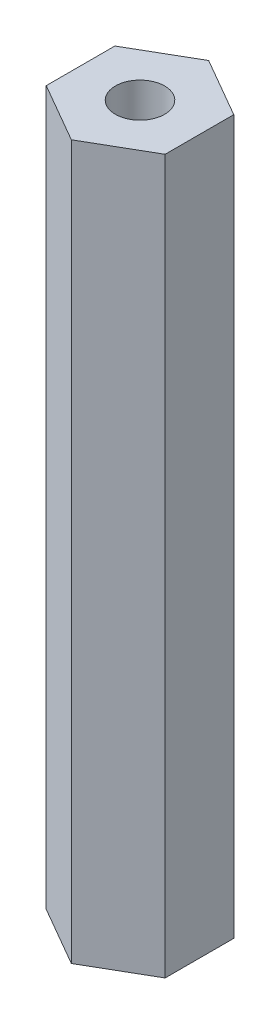
ISO-10303-21;
HEADER;
FILE_DESCRIPTION(('STEP AP214'),'2;1');
FILE_NAME('part.step','',(''),(''),'','','');
FILE_SCHEMA(('AUTOMOTIVE_DESIGN { 1 0 10303 214 1 1 1 1 }'));
ENDSEC;
DATA;
#1=APPLICATION_CONTEXT('core data for automotive mechanical design processes');
#2=APPLICATION_PROTOCOL_DEFINITION('international standard','automotive_design',2000,#1);
#3=PRODUCT_CONTEXT('',#1,'mechanical');
#4=PRODUCT('Part','Part','',(#3));
#5=PRODUCT_RELATED_PRODUCT_CATEGORY('part','',(#4));
#6=PRODUCT_DEFINITION_FORMATION('','',#4);
#7=PRODUCT_DEFINITION_CONTEXT('part definition',#1,'design');
#8=PRODUCT_DEFINITION('design','',#6,#7);
#9=PRODUCT_DEFINITION_SHAPE('','',#8);
#10=(LENGTH_UNIT() NAMED_UNIT(*) SI_UNIT(.MILLI.,.METRE.));
#11=(NAMED_UNIT(*) PLANE_ANGLE_UNIT() SI_UNIT($,.RADIAN.));
#12=(NAMED_UNIT(*) SI_UNIT($,.STERADIAN.) SOLID_ANGLE_UNIT());
#13=UNCERTAINTY_MEASURE_WITH_UNIT(LENGTH_MEASURE(1.E-05),#10,'distance_accuracy_value','');
#14=(GEOMETRIC_REPRESENTATION_CONTEXT(3) GLOBAL_UNCERTAINTY_ASSIGNED_CONTEXT((#13)) GLOBAL_UNIT_ASSIGNED_CONTEXT((#10,
#11,#12)) REPRESENTATION_CONTEXT('',''));
#15=CARTESIAN_POINT('',(0.,0.,0.));
#16=DIRECTION('',(0.,0.,1.));
#17=DIRECTION('',(1.,0.,0.));
#18=AXIS2_PLACEMENT_3D('',#15,#16,#17);
#19=CARTESIAN_POINT('',(0.,76.2,0.));
#20=DIRECTION('',(0.,1.,0.));
#21=DIRECTION('',(0.,0.,1.));
#22=AXIS2_PLACEMENT_3D('',#19,#20,#21);
#23=PLANE('',#22);
#24=DIRECTION('',(-0.866025403784442,0.,-0.499999999999995));
#25=VECTOR('',#24,1.);
#26=CARTESIAN_POINT('',(6.34999999999995,76.2,-3.66617420935419));
#27=LINE('',#26,#25);
#28=CARTESIAN_POINT('',(6.34999999999995,76.2,-3.66617420935419));
#29=VERTEX_POINT('',#28);
#30=CARTESIAN_POINT('',(0.,76.2,-7.33234841870824));
#31=VERTEX_POINT('',#30);
#32=EDGE_CURVE('E130',#29,#31,#27,.T.);
#33=ORIENTED_EDGE('',*,*,#32,.T.);
#34=DIRECTION('',(-0.866025403784438,0.,0.500000000000001));
#35=VECTOR('',#34,1.);
#36=CARTESIAN_POINT('',(0.,76.2,-7.33234841870824));
#37=LINE('',#36,#35);
#38=CARTESIAN_POINT('',(-6.35,76.2,-3.6661742093541));
#39=VERTEX_POINT('',#38);
#40=EDGE_CURVE('E88',#31,#39,#37,.T.);
#41=ORIENTED_EDGE('',*,*,#40,.T.);
#42=DIRECTION('',(0.,0.,1.));
#43=VECTOR('',#42,1.);
#44=CARTESIAN_POINT('',(-6.35,76.2,-3.6661742093541));
#45=LINE('',#44,#43);
#46=CARTESIAN_POINT('',(-6.34999999999997,76.2,3.66617420935415));
#47=VERTEX_POINT('',#46);
#48=EDGE_CURVE('E101',#39,#47,#45,.T.);
#49=ORIENTED_EDGE('',*,*,#48,.T.);
#50=DIRECTION('',(0.866025403784442,0.,0.499999999999995));
#51=VECTOR('',#50,1.);
#52=CARTESIAN_POINT('',(-6.34999999999997,76.2,3.66617420935415));
#53=LINE('',#52,#51);
#54=CARTESIAN_POINT('',(0.,76.2,7.33234841870823));
#55=VERTEX_POINT('',#54);
#56=EDGE_CURVE('E95',#47,#55,#53,.T.);
#57=ORIENTED_EDGE('',*,*,#56,.T.);
#58=DIRECTION('',(0.866025403784435,0.,-0.500000000000007));
#59=VECTOR('',#58,1.);
#60=CARTESIAN_POINT('',(0.,76.2,7.33234841870823));
#61=LINE('',#60,#59);
#62=CARTESIAN_POINT('',(6.35000000000002,76.2,3.66617420935406));
#63=VERTEX_POINT('',#62);
#64=EDGE_CURVE('E99',#55,#63,#61,.T.);
#65=ORIENTED_EDGE('',*,*,#64,.T.);
#66=DIRECTION('',(0.,0.,-1.));
#67=VECTOR('',#66,1.);
#68=CARTESIAN_POINT('',(6.35000000000002,76.2,3.66617420935406));
#69=LINE('',#68,#67);
#70=EDGE_CURVE('E51',#63,#29,#69,.T.);
#71=ORIENTED_EDGE('',*,*,#70,.T.);
#72=EDGE_LOOP('',(#33,#41,#49,#57,#65,#71));
#73=FACE_BOUND('',#72,.T.);
#74=CARTESIAN_POINT('',(0.,76.2,0.));
#75=DIRECTION('',(0.,1.,0.));
#76=DIRECTION('',(0.,0.,1.));
#77=AXIS2_PLACEMENT_3D('',#74,#75,#76);
#78=CIRCLE('',#77,2.6289);
#79=CARTESIAN_POINT('',(0.,76.2,-2.6289));
#80=VERTEX_POINT('',#79);
#81=EDGE_CURVE('E123',#80,#80,#78,.T.);
#82=ORIENTED_EDGE('',*,*,#81,.F.);
#83=EDGE_LOOP('',(#82));
#84=FACE_BOUND('',#83,.T.);
#85=ADVANCED_FACE('F34',(#73,#84),#23,.T.);
#86=CARTESIAN_POINT('',(0.,0.,0.));
#87=DIRECTION('',(0.,1.,0.));
#88=DIRECTION('',(0.,0.,1.));
#89=AXIS2_PLACEMENT_3D('',#86,#87,#88);
#90=PLANE('',#89);
#91=DIRECTION('',(-0.866025403784442,0.,-0.499999999999995));
#92=VECTOR('',#91,1.);
#93=CARTESIAN_POINT('',(6.34999999999995,0.,-3.66617420935419));
#94=LINE('',#93,#92);
#95=CARTESIAN_POINT('',(6.34999999999995,0.,-3.66617420935419));
#96=VERTEX_POINT('',#95);
#97=CARTESIAN_POINT('',(0.,0.,-7.33234841870824));
#98=VERTEX_POINT('',#97);
#99=EDGE_CURVE('E119',#96,#98,#94,.T.);
#100=ORIENTED_EDGE('',*,*,#99,.F.);
#101=DIRECTION('',(0.,0.,-1.));
#102=VECTOR('',#101,1.);
#103=CARTESIAN_POINT('',(6.35000000000002,0.,3.66617420935406));
#104=LINE('',#103,#102);
#105=CARTESIAN_POINT('',(6.35000000000002,0.,3.66617420935406));
#106=VERTEX_POINT('',#105);
#107=EDGE_CURVE('E80',#106,#96,#104,.T.);
#108=ORIENTED_EDGE('',*,*,#107,.F.);
#109=DIRECTION('',(0.866025403784435,0.,-0.500000000000007));
#110=VECTOR('',#109,1.);
#111=CARTESIAN_POINT('',(0.,0.,7.33234841870823));
#112=LINE('',#111,#110);
#113=CARTESIAN_POINT('',(0.,0.,7.33234841870823));
#114=VERTEX_POINT('',#113);
#115=EDGE_CURVE('E74',#114,#106,#112,.T.);
#116=ORIENTED_EDGE('',*,*,#115,.F.);
#117=DIRECTION('',(0.866025403784442,0.,0.499999999999995));
#118=VECTOR('',#117,1.);
#119=CARTESIAN_POINT('',(-6.34999999999997,0.,3.66617420935415));
#120=LINE('',#119,#118);
#121=CARTESIAN_POINT('',(-6.34999999999997,0.,3.66617420935415));
#122=VERTEX_POINT('',#121);
#123=EDGE_CURVE('E109',#122,#114,#120,.T.);
#124=ORIENTED_EDGE('',*,*,#123,.F.);
#125=DIRECTION('',(0.,0.,1.));
#126=VECTOR('',#125,1.);
#127=CARTESIAN_POINT('',(-6.35,0.,-3.6661742093541));
#128=LINE('',#127,#126);
#129=CARTESIAN_POINT('',(-6.35,0.,-3.6661742093541));
#130=VERTEX_POINT('',#129);
#131=EDGE_CURVE('E125',#130,#122,#128,.T.);
#132=ORIENTED_EDGE('',*,*,#131,.F.);
#133=DIRECTION('',(-0.866025403784438,0.,0.500000000000001));
#134=VECTOR('',#133,1.);
#135=CARTESIAN_POINT('',(0.,0.,-7.33234841870824));
#136=LINE('',#135,#134);
#137=EDGE_CURVE('E122',#98,#130,#136,.T.);
#138=ORIENTED_EDGE('',*,*,#137,.F.);
#139=EDGE_LOOP('',(#100,#108,#116,#124,#132,#138));
#140=FACE_BOUND('',#139,.T.);
#141=CARTESIAN_POINT('',(0.,0.,0.));
#142=DIRECTION('',(0.,1.,0.));
#143=DIRECTION('',(0.,0.,1.));
#144=AXIS2_PLACEMENT_3D('',#141,#142,#143);
#145=CIRCLE('',#144,2.6289);
#146=CARTESIAN_POINT('',(0.,0.,-2.6289));
#147=VERTEX_POINT('',#146);
#148=EDGE_CURVE('E223',#147,#147,#145,.T.);
#149=ORIENTED_EDGE('',*,*,#148,.T.);
#150=EDGE_LOOP('',(#149));
#151=FACE_BOUND('',#150,.T.);
#152=ADVANCED_FACE('F139',(#140,#151),#90,.F.);
#153=CARTESIAN_POINT('',(6.34999999999995,76.2,-3.66617420935419));
#154=DIRECTION('',(-0.499999999999995,0.,0.866025403784442));
#155=DIRECTION('',(0.866025403784442,0.,0.499999999999995));
#156=AXIS2_PLACEMENT_3D('',#153,#154,#155);
#157=PLANE('',#156);
#158=ORIENTED_EDGE('',*,*,#99,.T.);
#159=DIRECTION('',(0.,-1.,0.));
#160=VECTOR('',#159,1.);
#161=CARTESIAN_POINT('',(0.,76.2,-7.33234841870824));
#162=LINE('',#161,#160);
#163=EDGE_CURVE('E11',#31,#98,#162,.T.);
#164=ORIENTED_EDGE('',*,*,#163,.F.);
#165=ORIENTED_EDGE('',*,*,#32,.F.);
#166=DIRECTION('',(0.,-1.,0.));
#167=VECTOR('',#166,1.);
#168=CARTESIAN_POINT('',(6.34999999999995,76.2,-3.66617420935419));
#169=LINE('',#168,#167);
#170=EDGE_CURVE('E115',#29,#96,#169,.T.);
#171=ORIENTED_EDGE('',*,*,#170,.T.);
#172=EDGE_LOOP('',(#158,#164,#165,#171));
#173=FACE_BOUND('',#172,.T.);
#174=ADVANCED_FACE('F36',(#173),#157,.F.);
#175=CARTESIAN_POINT('',(0.,76.2,-7.33234841870824));
#176=DIRECTION('',(0.500000000000001,0.,0.866025403784438));
#177=DIRECTION('',(0.866025403784438,0.,-0.500000000000001));
#178=AXIS2_PLACEMENT_3D('',#175,#176,#177);
#179=PLANE('',#178);
#180=ORIENTED_EDGE('',*,*,#137,.T.);
#181=DIRECTION('',(0.,-1.,0.));
#182=VECTOR('',#181,1.);
#183=CARTESIAN_POINT('',(-6.35,76.2,-3.6661742093541));
#184=LINE('',#183,#182);
#185=EDGE_CURVE('E43',#39,#130,#184,.T.);
#186=ORIENTED_EDGE('',*,*,#185,.F.);
#187=ORIENTED_EDGE('',*,*,#40,.F.);
#188=ORIENTED_EDGE('',*,*,#163,.T.);
#189=EDGE_LOOP('',(#180,#186,#187,#188));
#190=FACE_BOUND('',#189,.T.);
#191=ADVANCED_FACE('F164',(#190),#179,.F.);
#192=CARTESIAN_POINT('',(-6.35,76.2,-3.6661742093541));
#193=DIRECTION('',(1.,0.,0.));
#194=DIRECTION('',(0.,0.,-1.));
#195=AXIS2_PLACEMENT_3D('',#192,#193,#194);
#196=PLANE('',#195);
#197=ORIENTED_EDGE('',*,*,#131,.T.);
#198=DIRECTION('',(0.,-1.,0.));
#199=VECTOR('',#198,1.);
#200=CARTESIAN_POINT('',(-6.34999999999997,76.2,3.66617420935415));
#201=LINE('',#200,#199);
#202=EDGE_CURVE('E110',#47,#122,#201,.T.);
#203=ORIENTED_EDGE('',*,*,#202,.F.);
#204=ORIENTED_EDGE('',*,*,#48,.F.);
#205=ORIENTED_EDGE('',*,*,#185,.T.);
#206=EDGE_LOOP('',(#197,#203,#204,#205));
#207=FACE_BOUND('',#206,.T.);
#208=ADVANCED_FACE('F136',(#207),#196,.F.);
#209=CARTESIAN_POINT('',(-6.34999999999997,76.2,3.66617420935415));
#210=DIRECTION('',(0.499999999999995,0.,-0.866025403784442));
#211=DIRECTION('',(-0.866025403784442,0.,-0.499999999999995));
#212=AXIS2_PLACEMENT_3D('',#209,#210,#211);
#213=PLANE('',#212);
#214=ORIENTED_EDGE('',*,*,#123,.T.);
#215=DIRECTION('',(0.,-1.,0.));
#216=VECTOR('',#215,1.);
#217=CARTESIAN_POINT('',(0.,76.2,7.33234841870823));
#218=LINE('',#217,#216);
#219=EDGE_CURVE('E106',#55,#114,#218,.T.);
#220=ORIENTED_EDGE('',*,*,#219,.F.);
#221=ORIENTED_EDGE('',*,*,#56,.F.);
#222=ORIENTED_EDGE('',*,*,#202,.T.);
#223=EDGE_LOOP('',(#214,#220,#221,#222));
#224=FACE_BOUND('',#223,.T.);
#225=ADVANCED_FACE('F107',(#224),#213,.F.);
#226=CARTESIAN_POINT('',(0.,76.2,7.33234841870823));
#227=DIRECTION('',(-0.500000000000007,0.,-0.866025403784435));
#228=DIRECTION('',(-0.866025403784435,0.,0.500000000000007));
#229=AXIS2_PLACEMENT_3D('',#226,#227,#228);
#230=PLANE('',#229);
#231=ORIENTED_EDGE('',*,*,#115,.T.);
#232=DIRECTION('',(0.,-1.,0.));
#233=VECTOR('',#232,1.);
#234=CARTESIAN_POINT('',(6.35000000000002,76.2,3.66617420935406));
#235=LINE('',#234,#233);
#236=EDGE_CURVE('E111',#63,#106,#235,.T.);
#237=ORIENTED_EDGE('',*,*,#236,.F.);
#238=ORIENTED_EDGE('',*,*,#64,.F.);
#239=ORIENTED_EDGE('',*,*,#219,.T.);
#240=EDGE_LOOP('',(#231,#237,#238,#239));
#241=FACE_BOUND('',#240,.T.);
#242=ADVANCED_FACE('F113',(#241),#230,.F.);
#243=CARTESIAN_POINT('',(6.35000000000002,76.2,3.66617420935406));
#244=DIRECTION('',(-1.,0.,0.));
#245=DIRECTION('',(0.,0.,1.));
#246=AXIS2_PLACEMENT_3D('',#243,#244,#245);
#247=PLANE('',#246);
#248=ORIENTED_EDGE('',*,*,#107,.T.);
#249=ORIENTED_EDGE('',*,*,#170,.F.);
#250=ORIENTED_EDGE('',*,*,#70,.F.);
#251=ORIENTED_EDGE('',*,*,#236,.T.);
#252=EDGE_LOOP('',(#248,#249,#250,#251));
#253=FACE_BOUND('',#252,.T.);
#254=ADVANCED_FACE('F144',(#253),#247,.F.);
#255=CARTESIAN_POINT('',(0.,76.2,0.));
#256=DIRECTION('',(0.,-1.,0.));
#257=DIRECTION('',(0.,0.,-1.));
#258=AXIS2_PLACEMENT_3D('',#255,#256,#257);
#259=CYLINDRICAL_SURFACE('',#258,2.6289);
#260=CARTESIAN_POINT('',(0.,76.2,-2.6289));
#261=CARTESIAN_POINT('',(0.,75.40625,-2.6289));
#262=CARTESIAN_POINT('',(0.,74.6125,-2.6289));
#263=CARTESIAN_POINT('',(0.,73.025,-2.6289));
#264=CARTESIAN_POINT('',(0.,72.23125,-2.6289));
#265=CARTESIAN_POINT('',(0.,70.64375,-2.6289));
#266=CARTESIAN_POINT('',(0.,69.85,-2.6289));
#267=CARTESIAN_POINT('',(0.,68.2625,-2.6289));
#268=CARTESIAN_POINT('',(0.,67.46875,-2.6289));
#269=CARTESIAN_POINT('',(0.,65.88125,-2.6289));
#270=CARTESIAN_POINT('',(0.,65.0875,-2.6289));
#271=CARTESIAN_POINT('',(0.,63.5,-2.6289));
#272=CARTESIAN_POINT('',(0.,62.70625,-2.6289));
#273=CARTESIAN_POINT('',(0.,61.11875,-2.6289));
#274=CARTESIAN_POINT('',(0.,60.325,-2.6289));
#275=CARTESIAN_POINT('',(0.,58.7375,-2.6289));
#276=CARTESIAN_POINT('',(0.,57.94375,-2.6289));
#277=CARTESIAN_POINT('',(0.,56.35625,-2.6289));
#278=CARTESIAN_POINT('',(0.,55.5625,-2.6289));
#279=CARTESIAN_POINT('',(0.,53.975,-2.6289));
#280=CARTESIAN_POINT('',(0.,53.18125,-2.6289));
#281=CARTESIAN_POINT('',(0.,51.59375,-2.6289));
#282=CARTESIAN_POINT('',(0.,50.8,-2.6289));
#283=CARTESIAN_POINT('',(0.,49.2125,-2.6289));
#284=CARTESIAN_POINT('',(0.,48.41875,-2.6289));
#285=CARTESIAN_POINT('',(0.,46.83125,-2.6289));
#286=CARTESIAN_POINT('',(0.,46.0375,-2.6289));
#287=CARTESIAN_POINT('',(0.,44.45,-2.6289));
#288=CARTESIAN_POINT('',(0.,43.65625,-2.6289));
#289=CARTESIAN_POINT('',(0.,42.06875,-2.6289));
#290=CARTESIAN_POINT('',(0.,41.275,-2.6289));
#291=CARTESIAN_POINT('',(0.,39.6875,-2.6289));
#292=CARTESIAN_POINT('',(0.,38.89375,-2.6289));
#293=CARTESIAN_POINT('',(0.,37.30625,-2.6289));
#294=CARTESIAN_POINT('',(0.,36.5125,-2.6289));
#295=CARTESIAN_POINT('',(0.,34.925,-2.6289));
#296=CARTESIAN_POINT('',(0.,34.13125,-2.6289));
#297=CARTESIAN_POINT('',(0.,32.54375,-2.6289));
#298=CARTESIAN_POINT('',(0.,31.75,-2.6289));
#299=CARTESIAN_POINT('',(0.,30.1625,-2.6289));
#300=CARTESIAN_POINT('',(0.,29.36875,-2.6289));
#301=CARTESIAN_POINT('',(0.,27.78125,-2.6289));
#302=CARTESIAN_POINT('',(0.,26.9875,-2.6289));
#303=CARTESIAN_POINT('',(0.,25.4,-2.6289));
#304=CARTESIAN_POINT('',(0.,24.60625,-2.6289));
#305=CARTESIAN_POINT('',(0.,23.01875,-2.6289));
#306=CARTESIAN_POINT('',(0.,22.225,-2.6289));
#307=CARTESIAN_POINT('',(0.,20.6375,-2.6289));
#308=CARTESIAN_POINT('',(0.,19.84375,-2.6289));
#309=CARTESIAN_POINT('',(0.,18.25625,-2.6289));
#310=CARTESIAN_POINT('',(0.,17.4625,-2.6289));
#311=CARTESIAN_POINT('',(0.,15.875,-2.6289));
#312=CARTESIAN_POINT('',(0.,15.08125,-2.6289));
#313=CARTESIAN_POINT('',(0.,13.49375,-2.6289));
#314=CARTESIAN_POINT('',(0.,12.7,-2.6289));
#315=CARTESIAN_POINT('',(0.,11.1125,-2.6289));
#316=CARTESIAN_POINT('',(0.,10.31875,-2.6289));
#317=CARTESIAN_POINT('',(0.,8.73125,-2.6289));
#318=CARTESIAN_POINT('',(0.,7.93750000000001,-2.6289));
#319=CARTESIAN_POINT('',(0.,6.35,-2.6289));
#320=CARTESIAN_POINT('',(0.,5.55625,-2.6289));
#321=CARTESIAN_POINT('',(0.,3.96875,-2.6289));
#322=CARTESIAN_POINT('',(0.,3.175,-2.6289));
#323=CARTESIAN_POINT('',(0.,1.5875,-2.6289));
#324=CARTESIAN_POINT('',(0.,0.793750000000001,-2.6289));
#325=CARTESIAN_POINT('',(0.,0.,-2.6289));
#326=B_SPLINE_CURVE_WITH_KNOTS('',3,(#260,#261,#262,#263,#264,#265,#266,#267,#268,#269,#270,
#271,#272,#273,#274,#275,#276,#277,#278,#279,#280,#281,#282,#283,#284,#285,#286,#287,#288,#289,
#290,#291,#292,#293,#294,#295,#296,#297,#298,#299,#300,#301,#302,#303,#304,#305,#306,#307,#308,
#309,#310,#311,#312,#313,#314,#315,#316,#317,#318,#319,#320,#321,#322,#323,#324,#325),
.UNSPECIFIED.,.F.,.F.,(4,2,2,2,2,2,2,2,2,2,2,2,2,2,2,2,2,2,2,2,2,2,2,2,2,2,2,2,2,2,2,2,4),(0.,
2.38124999999999,4.76249999999999,7.14374999999999,9.52499999999999,11.90625,14.2875,16.66875,
19.05,21.43125,23.8125,26.19375,28.575,30.95625,33.3375,35.71875,38.1,40.48125,42.8625,45.24375,
47.625,50.00625,52.3875,54.76875,57.15,59.53125,61.9125,64.29375,66.675,69.05625,71.4375,
73.81875,76.2),.UNSPECIFIED.);
#327=EDGE_CURVE('BSEAM146',#80,#147,#326,.T.);
#328=ORIENTED_EDGE('',*,*,#81,.T.);
#329=ORIENTED_EDGE('',*,*,#148,.F.);
#330=ORIENTED_EDGE('',*,*,#327,.T.);
#331=ORIENTED_EDGE('',*,*,#327,.F.);
#332=EDGE_LOOP('',(#328,#330,#329,#331));
#333=FACE_BOUND('',#332,.T.);
#334=ADVANCED_FACE('F146',(#333),#259,.F.);
#335=CLOSED_SHELL('',(#85,#152,#174,#191,#208,#225,#242,#254,#334));
#336=MANIFOLD_SOLID_BREP('B2',#335);
#337=ADVANCED_BREP_SHAPE_REPRESENTATION('',(#18,#336),#14);
#338=SHAPE_DEFINITION_REPRESENTATION(#9,#337);
ENDSEC;
END-ISO-10303-21;
